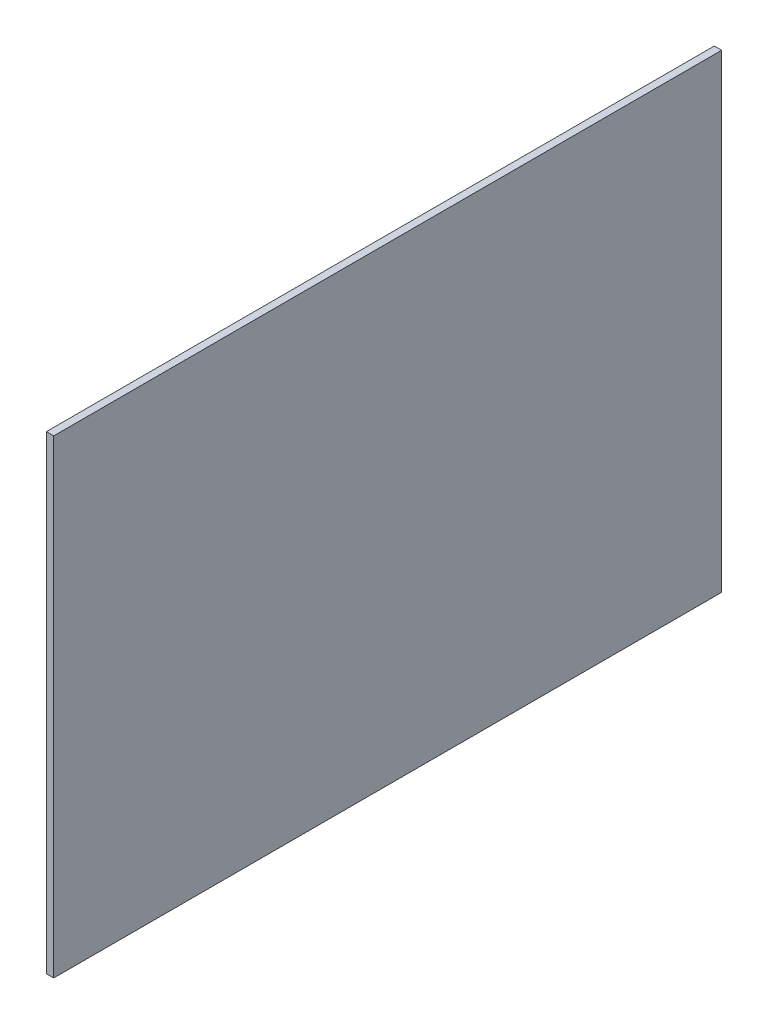
ISO-10303-21;
HEADER;
FILE_DESCRIPTION(('STEP AP214'),'2;1');
FILE_NAME('part.step','',(''),(''),'','','');
FILE_SCHEMA(('AUTOMOTIVE_DESIGN { 1 0 10303 214 1 1 1 1 }'));
ENDSEC;
DATA;
#1=APPLICATION_CONTEXT('core data for automotive mechanical design processes');
#2=APPLICATION_PROTOCOL_DEFINITION('international standard','automotive_design',2000,#1);
#3=PRODUCT_CONTEXT('',#1,'mechanical');
#4=PRODUCT('Part','Part','',(#3));
#5=PRODUCT_RELATED_PRODUCT_CATEGORY('part','',(#4));
#6=PRODUCT_DEFINITION_FORMATION('','',#4);
#7=PRODUCT_DEFINITION_CONTEXT('part definition',#1,'design');
#8=PRODUCT_DEFINITION('design','',#6,#7);
#9=PRODUCT_DEFINITION_SHAPE('','',#8);
#10=(LENGTH_UNIT() NAMED_UNIT(*) SI_UNIT(.MILLI.,.METRE.));
#11=(NAMED_UNIT(*) PLANE_ANGLE_UNIT() SI_UNIT($,.RADIAN.));
#12=(NAMED_UNIT(*) SI_UNIT($,.STERADIAN.) SOLID_ANGLE_UNIT());
#13=UNCERTAINTY_MEASURE_WITH_UNIT(LENGTH_MEASURE(1.E-05),#10,'distance_accuracy_value','');
#14=(GEOMETRIC_REPRESENTATION_CONTEXT(3) GLOBAL_UNCERTAINTY_ASSIGNED_CONTEXT((#13)) GLOBAL_UNIT_ASSIGNED_CONTEXT((#10,
#11,#12)) REPRESENTATION_CONTEXT('',''));
#15=CARTESIAN_POINT('',(0.,0.,0.));
#16=DIRECTION('',(0.,0.,1.));
#17=DIRECTION('',(1.,0.,0.));
#18=AXIS2_PLACEMENT_3D('',#15,#16,#17);
#19=CARTESIAN_POINT('',(-5.00000000000008,0.,468.5));
#20=DIRECTION('',(0.,-1.,0.));
#21=DIRECTION('',(0.,0.,-1.));
#22=AXIS2_PLACEMENT_3D('',#19,#20,#21);
#23=PLANE('',#22);
#24=DIRECTION('',(-1.,0.,0.));
#25=VECTOR('',#24,1.);
#26=CARTESIAN_POINT('',(-5.00000000000013,0.,30.));
#27=LINE('',#26,#25);
#28=CARTESIAN_POINT('',(-1.68753899743024E-13,0.,30.));
#29=VERTEX_POINT('',#28);
#30=CARTESIAN_POINT('',(-10.0000000000002,0.,30.));
#31=VERTEX_POINT('',#30);
#32=EDGE_CURVE('E85',#29,#31,#27,.T.);
#33=ORIENTED_EDGE('',*,*,#32,.F.);
#34=DIRECTION('',(0.,0.,1.));
#35=VECTOR('',#34,1.);
#36=CARTESIAN_POINT('',(0.,0.,0.));
#37=LINE('',#36,#35);
#38=CARTESIAN_POINT('',(-1.68753899743024E-13,0.,937.));
#39=VERTEX_POINT('',#38);
#40=EDGE_CURVE('E104',#29,#39,#37,.T.);
#41=ORIENTED_EDGE('',*,*,#40,.T.);
#42=DIRECTION('',(-1.,0.,0.));
#43=VECTOR('',#42,1.);
#44=CARTESIAN_POINT('',(-1.68753899743024E-13,0.,937.));
#45=LINE('',#44,#43);
#46=CARTESIAN_POINT('',(-10.0000000000002,0.,937.));
#47=VERTEX_POINT('',#46);
#48=EDGE_CURVE('E11',#39,#47,#45,.T.);
#49=ORIENTED_EDGE('',*,*,#48,.T.);
#50=DIRECTION('',(0.,0.,-1.));
#51=VECTOR('',#50,1.);
#52=CARTESIAN_POINT('',(-10.0000000000002,0.,937.));
#53=LINE('',#52,#51);
#54=EDGE_CURVE('E108',#47,#31,#53,.T.);
#55=ORIENTED_EDGE('',*,*,#54,.T.);
#56=EDGE_LOOP('',(#33,#41,#49,#55));
#57=FACE_BOUND('',#56,.T.);
#58=ADVANCED_FACE('F17',(#57),#23,.T.);
#59=CARTESIAN_POINT('',(-1.68753899743024E-13,0.,937.));
#60=DIRECTION('',(0.,0.,-1.));
#61=DIRECTION('',(0.,-1.,0.));
#62=AXIS2_PLACEMENT_3D('',#59,#60,#61);
#63=PLANE('',#62);
#64=ORIENTED_EDGE('',*,*,#48,.F.);
#65=DIRECTION('',(0.,1.,0.));
#66=VECTOR('',#65,1.);
#67=CARTESIAN_POINT('',(-1.68753899743024E-13,0.,937.));
#68=LINE('',#67,#66);
#69=CARTESIAN_POINT('',(-1.68753899743024E-13,637.5,937.));
#70=VERTEX_POINT('',#69);
#71=EDGE_CURVE('E101',#39,#70,#68,.T.);
#72=ORIENTED_EDGE('',*,*,#71,.T.);
#73=DIRECTION('',(-1.,0.,0.));
#74=VECTOR('',#73,1.);
#75=CARTESIAN_POINT('',(-1.68753899743024E-13,637.5,937.));
#76=LINE('',#75,#74);
#77=CARTESIAN_POINT('',(-10.0000000000002,637.5,937.));
#78=VERTEX_POINT('',#77);
#79=EDGE_CURVE('E77',#70,#78,#76,.T.);
#80=ORIENTED_EDGE('',*,*,#79,.T.);
#81=DIRECTION('',(0.,1.,0.));
#82=VECTOR('',#81,1.);
#83=CARTESIAN_POINT('',(-10.0000000000002,0.,937.));
#84=LINE('',#83,#82);
#85=EDGE_CURVE('E21',#47,#78,#84,.T.);
#86=ORIENTED_EDGE('',*,*,#85,.F.);
#87=EDGE_LOOP('',(#64,#72,#80,#86));
#88=FACE_BOUND('',#87,.T.);
#89=ADVANCED_FACE('F19',(#88),#63,.F.);
#90=CARTESIAN_POINT('',(-10.0000000000002,0.,937.));
#91=DIRECTION('',(1.,0.,0.));
#92=DIRECTION('',(0.,0.,1.));
#93=AXIS2_PLACEMENT_3D('',#90,#91,#92);
#94=PLANE('',#93);
#95=DIRECTION('',(0.,1.,0.));
#96=VECTOR('',#95,1.);
#97=CARTESIAN_POINT('',(-10.,159.375,30.));
#98=LINE('',#97,#96);
#99=CARTESIAN_POINT('',(-10.0000000000002,637.5,30.));
#100=VERTEX_POINT('',#99);
#101=EDGE_CURVE('E72',#31,#100,#98,.T.);
#102=ORIENTED_EDGE('',*,*,#101,.F.);
#103=ORIENTED_EDGE('',*,*,#54,.F.);
#104=ORIENTED_EDGE('',*,*,#85,.T.);
#105=DIRECTION('',(0.,0.,-1.));
#106=VECTOR('',#105,1.);
#107=CARTESIAN_POINT('',(-10.0000000000002,637.5,937.));
#108=LINE('',#107,#106);
#109=EDGE_CURVE('E68',#78,#100,#108,.T.);
#110=ORIENTED_EDGE('',*,*,#109,.T.);
#111=EDGE_LOOP('',(#102,#103,#104,#110));
#112=FACE_BOUND('',#111,.T.);
#113=ADVANCED_FACE('F70',(#112),#94,.F.);
#114=CARTESIAN_POINT('',(0.,0.,0.));
#115=DIRECTION('',(-1.,0.,0.));
#116=DIRECTION('',(0.,0.,1.));
#117=AXIS2_PLACEMENT_3D('',#114,#115,#116);
#118=PLANE('',#117);
#119=DIRECTION('',(0.,-1.,0.));
#120=VECTOR('',#119,1.);
#121=CARTESIAN_POINT('',(0.,159.375,30.));
#122=LINE('',#121,#120);
#123=CARTESIAN_POINT('',(-1.68753899743024E-13,637.5,30.));
#124=VERTEX_POINT('',#123);
#125=EDGE_CURVE('E90',#124,#29,#122,.T.);
#126=ORIENTED_EDGE('',*,*,#125,.F.);
#127=DIRECTION('',(0.,0.,1.));
#128=VECTOR('',#127,1.);
#129=CARTESIAN_POINT('',(0.,637.5,0.));
#130=LINE('',#129,#128);
#131=EDGE_CURVE('E55',#124,#70,#130,.T.);
#132=ORIENTED_EDGE('',*,*,#131,.T.);
#133=ORIENTED_EDGE('',*,*,#71,.F.);
#134=ORIENTED_EDGE('',*,*,#40,.F.);
#135=EDGE_LOOP('',(#126,#132,#133,#134));
#136=FACE_BOUND('',#135,.T.);
#137=ADVANCED_FACE('F146',(#136),#118,.F.);
#138=CARTESIAN_POINT('',(-5.00000000000008,637.5,468.5));
#139=DIRECTION('',(0.,-1.,0.));
#140=DIRECTION('',(0.,0.,-1.));
#141=AXIS2_PLACEMENT_3D('',#138,#139,#140);
#142=PLANE('',#141);
#143=DIRECTION('',(1.,0.,0.));
#144=VECTOR('',#143,1.);
#145=CARTESIAN_POINT('',(-5.00000000000013,637.5,30.));
#146=LINE('',#145,#144);
#147=EDGE_CURVE('E83',#100,#124,#146,.T.);
#148=ORIENTED_EDGE('',*,*,#147,.F.);
#149=ORIENTED_EDGE('',*,*,#109,.F.);
#150=ORIENTED_EDGE('',*,*,#79,.F.);
#151=ORIENTED_EDGE('',*,*,#131,.F.);
#152=EDGE_LOOP('',(#148,#149,#150,#151));
#153=FACE_BOUND('',#152,.T.);
#154=ADVANCED_FACE('F88',(#153),#142,.F.);
#155=CARTESIAN_POINT('',(-5.00000000000017,318.75,30.));
#156=DIRECTION('',(0.,0.,-1.));
#157=DIRECTION('',(0.,-1.,0.));
#158=AXIS2_PLACEMENT_3D('',#155,#156,#157);
#159=PLANE('',#158);
#160=ORIENTED_EDGE('',*,*,#147,.T.);
#161=ORIENTED_EDGE('',*,*,#125,.T.);
#162=ORIENTED_EDGE('',*,*,#32,.T.);
#163=ORIENTED_EDGE('',*,*,#101,.T.);
#164=EDGE_LOOP('',(#160,#161,#162,#163));
#165=FACE_BOUND('',#164,.T.);
#166=ADVANCED_FACE('F81',(#165),#159,.T.);
#167=CLOSED_SHELL('',(#58,#89,#113,#137,#154,#166));
#168=MANIFOLD_SOLID_BREP('B1',#167);
#169=ADVANCED_BREP_SHAPE_REPRESENTATION('',(#18,#168),#14);
#170=SHAPE_DEFINITION_REPRESENTATION(#9,#169);
ENDSEC;
END-ISO-10303-21;
